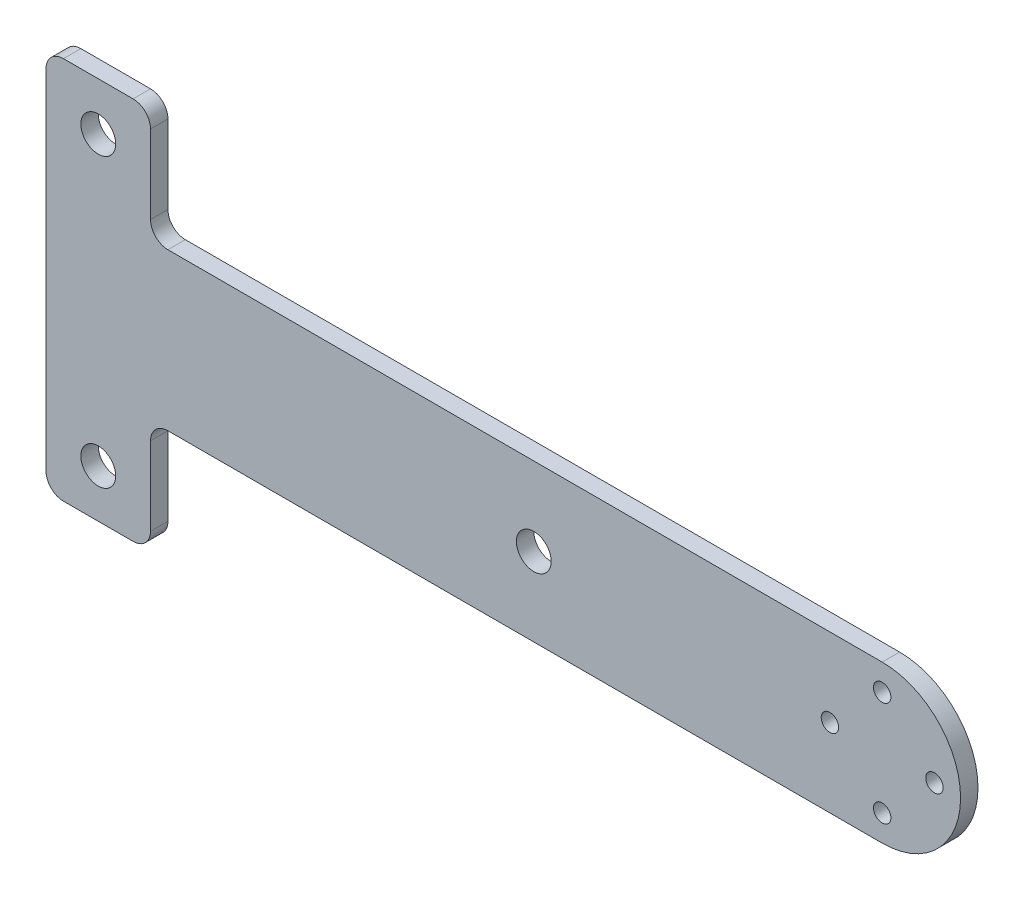
ISO-10303-21;
HEADER;
FILE_DESCRIPTION(('STEP AP214'),'2;1');
FILE_NAME('part.step','',(''),(''),'','','');
FILE_SCHEMA(('AUTOMOTIVE_DESIGN { 1 0 10303 214 1 1 1 1 }'));
ENDSEC;
DATA;
#1=APPLICATION_CONTEXT('core data for automotive mechanical design processes');
#2=APPLICATION_PROTOCOL_DEFINITION('international standard','automotive_design',2000,#1);
#3=PRODUCT_CONTEXT('',#1,'mechanical');
#4=PRODUCT('Part','Part','',(#3));
#5=PRODUCT_RELATED_PRODUCT_CATEGORY('part','',(#4));
#6=PRODUCT_DEFINITION_FORMATION('','',#4);
#7=PRODUCT_DEFINITION_CONTEXT('part definition',#1,'design');
#8=PRODUCT_DEFINITION('design','',#6,#7);
#9=PRODUCT_DEFINITION_SHAPE('','',#8);
#10=(LENGTH_UNIT() NAMED_UNIT(*) SI_UNIT(.MILLI.,.METRE.));
#11=(NAMED_UNIT(*) PLANE_ANGLE_UNIT() SI_UNIT($,.RADIAN.));
#12=(NAMED_UNIT(*) SI_UNIT($,.STERADIAN.) SOLID_ANGLE_UNIT());
#13=UNCERTAINTY_MEASURE_WITH_UNIT(LENGTH_MEASURE(1.E-05),#10,'distance_accuracy_value','');
#14=(GEOMETRIC_REPRESENTATION_CONTEXT(3) GLOBAL_UNCERTAINTY_ASSIGNED_CONTEXT((#13)) GLOBAL_UNIT_ASSIGNED_CONTEXT((#10,
#11,#12)) REPRESENTATION_CONTEXT('',''));
#15=CARTESIAN_POINT('',(0.,0.,0.));
#16=DIRECTION('',(0.,0.,1.));
#17=DIRECTION('',(1.,0.,0.));
#18=AXIS2_PLACEMENT_3D('',#15,#16,#17);
#19=CARTESIAN_POINT('',(41.2764285714286,0.145714285714315,2.));
#20=DIRECTION('',(0.,0.,-1.));
#21=DIRECTION('',(-1.,0.,0.));
#22=AXIS2_PLACEMENT_3D('',#19,#20,#21);
#23=CYLINDRICAL_SURFACE('',#22,9.);
#24=CARTESIAN_POINT('',(41.2764285714286,0.145714285714315,0.));
#25=DIRECTION('',(0.,0.,1.));
#26=DIRECTION('',(1.,0.,0.));
#27=AXIS2_PLACEMENT_3D('',#24,#25,#26);
#28=CIRCLE('',#27,9.);
#29=CARTESIAN_POINT('',(41.2764285714286,9.14571428571432,0.));
#30=VERTEX_POINT('',#29);
#31=CARTESIAN_POINT('',(41.2764285714286,-8.85428571428569,0.));
#32=VERTEX_POINT('',#31);
#33=EDGE_CURVE('E148',#30,#32,#28,.F.);
#34=ORIENTED_EDGE('',*,*,#33,.F.);
#35=DIRECTION('',(0.,0.,-1.));
#36=VECTOR('',#35,1.);
#37=CARTESIAN_POINT('',(41.2764285714286,9.14571428571432,2.));
#38=LINE('',#37,#36);
#39=CARTESIAN_POINT('',(41.2764285714286,9.14571428571432,2.));
#40=VERTEX_POINT('',#39);
#41=EDGE_CURVE('E143',#40,#30,#38,.T.);
#42=ORIENTED_EDGE('',*,*,#41,.F.);
#43=CARTESIAN_POINT('',(41.2764285714286,0.145714285714315,2.));
#44=DIRECTION('',(0.,0.,1.));
#45=DIRECTION('',(1.,0.,0.));
#46=AXIS2_PLACEMENT_3D('',#43,#44,#45);
#47=CIRCLE('',#46,9.);
#48=CARTESIAN_POINT('',(41.2764285714286,-8.85428571428569,2.));
#49=VERTEX_POINT('',#48);
#50=EDGE_CURVE('E146',#40,#49,#47,.F.);
#51=ORIENTED_EDGE('',*,*,#50,.T.);
#52=DIRECTION('',(0.,0.,-1.));
#53=VECTOR('',#52,1.);
#54=CARTESIAN_POINT('',(41.2764285714286,-8.85428571428569,2.));
#55=LINE('',#54,#53);
#56=EDGE_CURVE('E153',#49,#32,#55,.T.);
#57=ORIENTED_EDGE('',*,*,#56,.T.);
#58=EDGE_LOOP('',(#34,#42,#51,#57));
#59=FACE_BOUND('',#58,.T.);
#60=ADVANCED_FACE('F41',(#59),#23,.T.);
#61=CARTESIAN_POINT('',(0.,9.14571428571431,2.));
#62=DIRECTION('',(0.,-1.,0.));
#63=DIRECTION('',(1.,0.,0.));
#64=AXIS2_PLACEMENT_3D('',#61,#62,#63);
#65=PLANE('',#64);
#66=DIRECTION('',(-1.,0.,0.));
#67=VECTOR('',#66,1.);
#68=CARTESIAN_POINT('',(0.,9.14571428571431,0.));
#69=LINE('',#68,#67);
#70=CARTESIAN_POINT('',(-40.7235714285714,9.14571428571431,0.));
#71=VERTEX_POINT('',#70);
#72=EDGE_CURVE('E208',#30,#71,#69,.T.);
#73=ORIENTED_EDGE('',*,*,#72,.T.);
#74=DIRECTION('',(0.,0.,-1.));
#75=VECTOR('',#74,1.);
#76=CARTESIAN_POINT('',(-40.7235714285714,9.14571428571431,2.));
#77=LINE('',#76,#75);
#78=CARTESIAN_POINT('',(-40.7235714285714,9.14571428571431,2.));
#79=VERTEX_POINT('',#78);
#80=EDGE_CURVE('E159',#71,#79,#77,.F.);
#81=ORIENTED_EDGE('',*,*,#80,.T.);
#82=DIRECTION('',(-1.,0.,0.));
#83=VECTOR('',#82,1.);
#84=CARTESIAN_POINT('',(0.,9.14571428571431,2.));
#85=LINE('',#84,#83);
#86=EDGE_CURVE('E156',#40,#79,#85,.T.);
#87=ORIENTED_EDGE('',*,*,#86,.F.);
#88=ORIENTED_EDGE('',*,*,#41,.T.);
#89=EDGE_LOOP('',(#73,#81,#87,#88));
#90=FACE_BOUND('',#89,.T.);
#91=ADVANCED_FACE('F157',(#90),#65,.F.);
#92=CARTESIAN_POINT('',(-42.7235714285714,0.,2.));
#93=DIRECTION('',(-1.,0.,0.));
#94=DIRECTION('',(0.,0.,1.));
#95=AXIS2_PLACEMENT_3D('',#92,#93,#94);
#96=PLANE('',#95);
#97=DIRECTION('',(0.,1.,0.));
#98=VECTOR('',#97,1.);
#99=CARTESIAN_POINT('',(-42.7235714285714,0.,2.));
#100=LINE('',#99,#98);
#101=CARTESIAN_POINT('',(-42.7235714285714,11.1457142857143,2.));
#102=VERTEX_POINT('',#101);
#103=CARTESIAN_POINT('',(-42.7235714285714,20.1457142857143,2.));
#104=VERTEX_POINT('',#103);
#105=EDGE_CURVE('E161',#102,#104,#100,.T.);
#106=ORIENTED_EDGE('',*,*,#105,.F.);
#107=DIRECTION('',(0.,0.,-1.));
#108=VECTOR('',#107,1.);
#109=CARTESIAN_POINT('',(-42.7235714285714,11.1457142857143,0.));
#110=LINE('',#109,#108);
#111=CARTESIAN_POINT('',(-42.7235714285714,11.1457142857143,0.));
#112=VERTEX_POINT('',#111);
#113=EDGE_CURVE('E246',#102,#112,#110,.T.);
#114=ORIENTED_EDGE('',*,*,#113,.T.);
#115=DIRECTION('',(0.,1.,0.));
#116=VECTOR('',#115,1.);
#117=CARTESIAN_POINT('',(-42.7235714285714,0.,0.));
#118=LINE('',#117,#116);
#119=CARTESIAN_POINT('',(-42.7235714285714,20.1457142857143,0.));
#120=VERTEX_POINT('',#119);
#121=EDGE_CURVE('E210',#112,#120,#118,.T.);
#122=ORIENTED_EDGE('',*,*,#121,.T.);
#123=DIRECTION('',(0.,0.,-1.));
#124=VECTOR('',#123,1.);
#125=CARTESIAN_POINT('',(-42.7235714285714,20.1457142857143,2.));
#126=LINE('',#125,#124);
#127=EDGE_CURVE('E152',#120,#104,#126,.F.);
#128=ORIENTED_EDGE('',*,*,#127,.T.);
#129=EDGE_LOOP('',(#106,#114,#122,#128));
#130=FACE_BOUND('',#129,.T.);
#131=ADVANCED_FACE('F311',(#130),#96,.F.);
#132=CARTESIAN_POINT('',(0.,22.1457142857143,2.));
#133=DIRECTION('',(0.,-1.,0.));
#134=DIRECTION('',(0.,0.,-1.));
#135=AXIS2_PLACEMENT_3D('',#132,#133,#134);
#136=PLANE('',#135);
#137=DIRECTION('',(-1.,0.,0.));
#138=VECTOR('',#137,1.);
#139=CARTESIAN_POINT('',(0.,22.1457142857143,2.));
#140=LINE('',#139,#138);
#141=CARTESIAN_POINT('',(-44.7235714285714,22.1457142857143,2.));
#142=VERTEX_POINT('',#141);
#143=CARTESIAN_POINT('',(-52.7235714285714,22.1457142857143,2.));
#144=VERTEX_POINT('',#143);
#145=EDGE_CURVE('E174',#142,#144,#140,.T.);
#146=ORIENTED_EDGE('',*,*,#145,.F.);
#147=DIRECTION('',(0.,0.,-1.));
#148=VECTOR('',#147,1.);
#149=CARTESIAN_POINT('',(-44.7235714285714,22.1457142857143,2.));
#150=LINE('',#149,#148);
#151=CARTESIAN_POINT('',(-44.7235714285714,22.1457142857143,0.));
#152=VERTEX_POINT('',#151);
#153=EDGE_CURVE('E252',#142,#152,#150,.T.);
#154=ORIENTED_EDGE('',*,*,#153,.T.);
#155=DIRECTION('',(-1.,0.,0.));
#156=VECTOR('',#155,1.);
#157=CARTESIAN_POINT('',(0.,22.1457142857143,0.));
#158=LINE('',#157,#156);
#159=CARTESIAN_POINT('',(-52.7235714285714,22.1457142857143,0.));
#160=VERTEX_POINT('',#159);
#161=EDGE_CURVE('E213',#152,#160,#158,.T.);
#162=ORIENTED_EDGE('',*,*,#161,.T.);
#163=DIRECTION('',(0.,0.,-1.));
#164=VECTOR('',#163,1.);
#165=CARTESIAN_POINT('',(-52.7235714285714,22.1457142857143,2.));
#166=LINE('',#165,#164);
#167=EDGE_CURVE('E250',#160,#144,#166,.F.);
#168=ORIENTED_EDGE('',*,*,#167,.T.);
#169=EDGE_LOOP('',(#146,#154,#162,#168));
#170=FACE_BOUND('',#169,.T.);
#171=ADVANCED_FACE('F319',(#170),#136,.F.);
#172=CARTESIAN_POINT('',(-54.7235714285714,0.,2.));
#173=DIRECTION('',(1.,0.,0.));
#174=DIRECTION('',(0.,0.,-1.));
#175=AXIS2_PLACEMENT_3D('',#172,#173,#174);
#176=PLANE('',#175);
#177=DIRECTION('',(0.,-1.,0.));
#178=VECTOR('',#177,1.);
#179=CARTESIAN_POINT('',(-54.7235714285714,0.,2.));
#180=LINE('',#179,#178);
#181=CARTESIAN_POINT('',(-54.7235714285714,20.1457142857143,2.));
#182=VERTEX_POINT('',#181);
#183=CARTESIAN_POINT('',(-54.7235714285714,-19.8542857142857,2.));
#184=VERTEX_POINT('',#183);
#185=EDGE_CURVE('E177',#182,#184,#180,.T.);
#186=ORIENTED_EDGE('',*,*,#185,.F.);
#187=DIRECTION('',(0.,0.,-1.));
#188=VECTOR('',#187,1.);
#189=CARTESIAN_POINT('',(-54.7235714285714,20.1457142857143,2.));
#190=LINE('',#189,#188);
#191=CARTESIAN_POINT('',(-54.7235714285714,20.1457142857143,0.));
#192=VERTEX_POINT('',#191);
#193=EDGE_CURVE('E273',#182,#192,#190,.T.);
#194=ORIENTED_EDGE('',*,*,#193,.T.);
#195=DIRECTION('',(0.,-1.,0.));
#196=VECTOR('',#195,1.);
#197=CARTESIAN_POINT('',(-54.7235714285714,0.,0.));
#198=LINE('',#197,#196);
#199=CARTESIAN_POINT('',(-54.7235714285714,-19.8542857142857,0.));
#200=VERTEX_POINT('',#199);
#201=EDGE_CURVE('E216',#192,#200,#198,.T.);
#202=ORIENTED_EDGE('',*,*,#201,.T.);
#203=DIRECTION('',(0.,0.,-1.));
#204=VECTOR('',#203,1.);
#205=CARTESIAN_POINT('',(-54.7235714285714,-19.8542857142857,2.));
#206=LINE('',#205,#204);
#207=EDGE_CURVE('E271',#200,#184,#206,.F.);
#208=ORIENTED_EDGE('',*,*,#207,.T.);
#209=EDGE_LOOP('',(#186,#194,#202,#208));
#210=FACE_BOUND('',#209,.T.);
#211=ADVANCED_FACE('F327',(#210),#176,.F.);
#212=CARTESIAN_POINT('',(0.,-21.8542857142857,2.));
#213=DIRECTION('',(0.,1.,0.));
#214=DIRECTION('',(0.,0.,1.));
#215=AXIS2_PLACEMENT_3D('',#212,#213,#214);
#216=PLANE('',#215);
#217=DIRECTION('',(1.,0.,0.));
#218=VECTOR('',#217,1.);
#219=CARTESIAN_POINT('',(0.,-21.8542857142857,0.));
#220=LINE('',#219,#218);
#221=CARTESIAN_POINT('',(-52.7235714285714,-21.8542857142857,0.));
#222=VERTEX_POINT('',#221);
#223=CARTESIAN_POINT('',(-44.7235714285714,-21.8542857142857,0.));
#224=VERTEX_POINT('',#223);
#225=EDGE_CURVE('E219',#222,#224,#220,.T.);
#226=ORIENTED_EDGE('',*,*,#225,.T.);
#227=DIRECTION('',(0.,0.,-1.));
#228=VECTOR('',#227,1.);
#229=CARTESIAN_POINT('',(-44.7235714285714,-21.8542857142857,2.));
#230=LINE('',#229,#228);
#231=CARTESIAN_POINT('',(-44.7235714285714,-21.8542857142857,2.));
#232=VERTEX_POINT('',#231);
#233=EDGE_CURVE('E286',#224,#232,#230,.F.);
#234=ORIENTED_EDGE('',*,*,#233,.T.);
#235=DIRECTION('',(1.,0.,0.));
#236=VECTOR('',#235,1.);
#237=CARTESIAN_POINT('',(0.,-21.8542857142857,2.));
#238=LINE('',#237,#236);
#239=CARTESIAN_POINT('',(-52.7235714285714,-21.8542857142857,2.));
#240=VERTEX_POINT('',#239);
#241=EDGE_CURVE('E180',#240,#232,#238,.T.);
#242=ORIENTED_EDGE('',*,*,#241,.F.);
#243=DIRECTION('',(0.,0.,-1.));
#244=VECTOR('',#243,1.);
#245=CARTESIAN_POINT('',(-52.7235714285714,-21.8542857142857,2.));
#246=LINE('',#245,#244);
#247=EDGE_CURVE('E283',#240,#222,#246,.T.);
#248=ORIENTED_EDGE('',*,*,#247,.T.);
#249=EDGE_LOOP('',(#226,#234,#242,#248));
#250=FACE_BOUND('',#249,.T.);
#251=ADVANCED_FACE('F335',(#250),#216,.F.);
#252=CARTESIAN_POINT('',(-42.7235714285714,0.,2.));
#253=DIRECTION('',(-1.,0.,0.));
#254=DIRECTION('',(0.,-1.,0.));
#255=AXIS2_PLACEMENT_3D('',#252,#253,#254);
#256=PLANE('',#255);
#257=DIRECTION('',(0.,1.,0.));
#258=VECTOR('',#257,1.);
#259=CARTESIAN_POINT('',(-42.7235714285714,0.,0.));
#260=LINE('',#259,#258);
#261=CARTESIAN_POINT('',(-42.7235714285714,-19.8542857142857,0.));
#262=VERTEX_POINT('',#261);
#263=CARTESIAN_POINT('',(-42.7235714285714,-10.8542857142857,0.));
#264=VERTEX_POINT('',#263);
#265=EDGE_CURVE('E222',#262,#264,#260,.T.);
#266=ORIENTED_EDGE('',*,*,#265,.T.);
#267=DIRECTION('',(0.,0.,-1.));
#268=VECTOR('',#267,1.);
#269=CARTESIAN_POINT('',(-42.7235714285714,-10.8542857142857,2.));
#270=LINE('',#269,#268);
#271=CARTESIAN_POINT('',(-42.7235714285714,-10.8542857142857,2.));
#272=VERTEX_POINT('',#271);
#273=EDGE_CURVE('E62',#264,#272,#270,.F.);
#274=ORIENTED_EDGE('',*,*,#273,.T.);
#275=DIRECTION('',(0.,1.,0.));
#276=VECTOR('',#275,1.);
#277=CARTESIAN_POINT('',(-42.7235714285714,0.,2.));
#278=LINE('',#277,#276);
#279=CARTESIAN_POINT('',(-42.7235714285714,-19.8542857142857,2.));
#280=VERTEX_POINT('',#279);
#281=EDGE_CURVE('E183',#280,#272,#278,.T.);
#282=ORIENTED_EDGE('',*,*,#281,.F.);
#283=DIRECTION('',(0.,0.,-1.));
#284=VECTOR('',#283,1.);
#285=CARTESIAN_POINT('',(-42.7235714285714,-19.8542857142857,2.));
#286=LINE('',#285,#284);
#287=EDGE_CURVE('E279',#280,#262,#286,.T.);
#288=ORIENTED_EDGE('',*,*,#287,.T.);
#289=EDGE_LOOP('',(#266,#274,#282,#288));
#290=FACE_BOUND('',#289,.T.);
#291=ADVANCED_FACE('F299',(#290),#256,.F.);
#292=CARTESIAN_POINT('',(-48.7235714285714,16.6457142857143,2.));
#293=DIRECTION('',(0.,0.,-1.));
#294=DIRECTION('',(-1.,0.,0.));
#295=AXIS2_PLACEMENT_3D('',#292,#293,#294);
#296=CYLINDRICAL_SURFACE('',#295,2.);
#297=CARTESIAN_POINT('',(-48.7235714285714,16.6457142857143,2.));
#298=DIRECTION('',(0.,0.,1.));
#299=DIRECTION('',(1.,0.,0.));
#300=AXIS2_PLACEMENT_3D('',#297,#298,#299);
#301=CIRCLE('',#300,2.);
#302=CARTESIAN_POINT('',(-46.7235714285714,16.6457142857143,2.));
#303=VERTEX_POINT('',#302);
#304=EDGE_CURVE('E198',#303,#303,#301,.T.);
#305=ORIENTED_EDGE('',*,*,#304,.T.);
#306=EDGE_LOOP('',(#305));
#307=FACE_BOUND('',#306,.T.);
#308=CARTESIAN_POINT('',(-48.7235714285714,16.6457142857143,0.));
#309=DIRECTION('',(0.,0.,1.));
#310=DIRECTION('',(1.,0.,0.));
#311=AXIS2_PLACEMENT_3D('',#308,#309,#310);
#312=CIRCLE('',#311,2.);
#313=CARTESIAN_POINT('',(-46.7235714285714,16.6457142857143,0.));
#314=VERTEX_POINT('',#313);
#315=EDGE_CURVE('E239',#314,#314,#312,.T.);
#316=ORIENTED_EDGE('',*,*,#315,.F.);
#317=EDGE_LOOP('',(#316));
#318=FACE_BOUND('',#317,.T.);
#319=ADVANCED_FACE('F468',(#307,#318),#296,.F.);
#320=CARTESIAN_POINT('',(1.27642857142862,0.145714285714315,2.));
#321=DIRECTION('',(0.,0.,-1.));
#322=DIRECTION('',(-1.,0.,0.));
#323=AXIS2_PLACEMENT_3D('',#320,#321,#322);
#324=CYLINDRICAL_SURFACE('',#323,2.);
#325=CARTESIAN_POINT('',(1.27642857142862,0.145714285714315,2.));
#326=DIRECTION('',(0.,0.,1.));
#327=DIRECTION('',(1.,0.,0.));
#328=AXIS2_PLACEMENT_3D('',#325,#326,#327);
#329=CIRCLE('',#328,2.);
#330=CARTESIAN_POINT('',(3.27642857142862,0.145714285714315,2.));
#331=VERTEX_POINT('',#330);
#332=EDGE_CURVE('E195',#331,#331,#329,.T.);
#333=ORIENTED_EDGE('',*,*,#332,.T.);
#334=EDGE_LOOP('',(#333));
#335=FACE_BOUND('',#334,.T.);
#336=CARTESIAN_POINT('',(1.27642857142862,0.145714285714315,0.));
#337=DIRECTION('',(0.,0.,1.));
#338=DIRECTION('',(1.,0.,0.));
#339=AXIS2_PLACEMENT_3D('',#336,#337,#338);
#340=CIRCLE('',#339,2.);
#341=CARTESIAN_POINT('',(3.27642857142862,0.145714285714315,0.));
#342=VERTEX_POINT('',#341);
#343=EDGE_CURVE('E236',#342,#342,#340,.T.);
#344=ORIENTED_EDGE('',*,*,#343,.F.);
#345=EDGE_LOOP('',(#344));
#346=FACE_BOUND('',#345,.T.);
#347=ADVANCED_FACE('F459',(#335,#346),#324,.F.);
#348=CARTESIAN_POINT('',(47.2764285714288,0.145714285714464,2.));
#349=DIRECTION('',(0.,0.,-1.));
#350=DIRECTION('',(-1.,0.,0.));
#351=AXIS2_PLACEMENT_3D('',#348,#349,#350);
#352=CYLINDRICAL_SURFACE('',#351,0.999999999999998);
#353=CARTESIAN_POINT('',(47.2764285714288,0.145714285714464,2.));
#354=DIRECTION('',(0.,0.,1.));
#355=DIRECTION('',(1.,0.,0.));
#356=AXIS2_PLACEMENT_3D('',#353,#354,#355);
#357=CIRCLE('',#356,0.999999999999998);
#358=CARTESIAN_POINT('',(48.2764285714288,0.145714285714464,2.));
#359=VERTEX_POINT('',#358);
#360=EDGE_CURVE('E192',#359,#359,#357,.T.);
#361=ORIENTED_EDGE('',*,*,#360,.T.);
#362=EDGE_LOOP('',(#361));
#363=FACE_BOUND('',#362,.T.);
#364=CARTESIAN_POINT('',(47.2764285714288,0.145714285714464,0.));
#365=DIRECTION('',(0.,0.,1.));
#366=DIRECTION('',(1.,0.,0.));
#367=AXIS2_PLACEMENT_3D('',#364,#365,#366);
#368=CIRCLE('',#367,0.999999999999998);
#369=CARTESIAN_POINT('',(48.2764285714288,0.145714285714464,0.));
#370=VERTEX_POINT('',#369);
#371=EDGE_CURVE('E233',#370,#370,#368,.T.);
#372=ORIENTED_EDGE('',*,*,#371,.F.);
#373=EDGE_LOOP('',(#372));
#374=FACE_BOUND('',#373,.T.);
#375=ADVANCED_FACE('F450',(#363,#374),#352,.F.);
#376=CARTESIAN_POINT('',(41.2764285714289,-5.85428571428569,2.));
#377=DIRECTION('',(0.,0.,-1.));
#378=DIRECTION('',(-1.,0.,0.));
#379=AXIS2_PLACEMENT_3D('',#376,#377,#378);
#380=CYLINDRICAL_SURFACE('',#379,0.999999999999998);
#381=CARTESIAN_POINT('',(41.2764285714289,-5.85428571428569,2.));
#382=DIRECTION('',(0.,0.,1.));
#383=DIRECTION('',(1.,0.,0.));
#384=AXIS2_PLACEMENT_3D('',#381,#382,#383);
#385=CIRCLE('',#384,0.999999999999998);
#386=CARTESIAN_POINT('',(42.2764285714289,-5.85428571428569,2.));
#387=VERTEX_POINT('',#386);
#388=EDGE_CURVE('E189',#387,#387,#385,.T.);
#389=ORIENTED_EDGE('',*,*,#388,.T.);
#390=EDGE_LOOP('',(#389));
#391=FACE_BOUND('',#390,.T.);
#392=CARTESIAN_POINT('',(41.2764285714289,-5.85428571428569,0.));
#393=DIRECTION('',(0.,0.,1.));
#394=DIRECTION('',(1.,0.,0.));
#395=AXIS2_PLACEMENT_3D('',#392,#393,#394);
#396=CIRCLE('',#395,0.999999999999998);
#397=CARTESIAN_POINT('',(42.2764285714289,-5.85428571428569,0.));
#398=VERTEX_POINT('',#397);
#399=EDGE_CURVE('E230',#398,#398,#396,.T.);
#400=ORIENTED_EDGE('',*,*,#399,.F.);
#401=EDGE_LOOP('',(#400));
#402=FACE_BOUND('',#401,.T.);
#403=ADVANCED_FACE('F441',(#391,#402),#380,.F.);
#404=CARTESIAN_POINT('',(35.2764285714288,0.145714285714214,2.));
#405=DIRECTION('',(0.,0.,-1.));
#406=DIRECTION('',(-1.,0.,0.));
#407=AXIS2_PLACEMENT_3D('',#404,#405,#406);
#408=CYLINDRICAL_SURFACE('',#407,0.999999999999998);
#409=CARTESIAN_POINT('',(35.2764285714288,0.145714285714214,2.));
#410=DIRECTION('',(0.,0.,1.));
#411=DIRECTION('',(1.,0.,0.));
#412=AXIS2_PLACEMENT_3D('',#409,#410,#411);
#413=CIRCLE('',#412,0.999999999999998);
#414=CARTESIAN_POINT('',(36.2764285714288,0.145714285714214,2.));
#415=VERTEX_POINT('',#414);
#416=EDGE_CURVE('E186',#415,#415,#413,.T.);
#417=ORIENTED_EDGE('',*,*,#416,.T.);
#418=EDGE_LOOP('',(#417));
#419=FACE_BOUND('',#418,.T.);
#420=CARTESIAN_POINT('',(35.2764285714288,0.145714285714214,0.));
#421=DIRECTION('',(0.,0.,1.));
#422=DIRECTION('',(1.,0.,0.));
#423=AXIS2_PLACEMENT_3D('',#420,#421,#422);
#424=CIRCLE('',#423,0.999999999999998);
#425=CARTESIAN_POINT('',(36.2764285714288,0.145714285714214,0.));
#426=VERTEX_POINT('',#425);
#427=EDGE_CURVE('E227',#426,#426,#424,.T.);
#428=ORIENTED_EDGE('',*,*,#427,.F.);
#429=EDGE_LOOP('',(#428));
#430=FACE_BOUND('',#429,.T.);
#431=ADVANCED_FACE('F434',(#419,#430),#408,.F.);
#432=CARTESIAN_POINT('',(0.,-8.85428571428569,2.));
#433=DIRECTION('',(0.,-1.,0.));
#434=DIRECTION('',(1.,0.,0.));
#435=AXIS2_PLACEMENT_3D('',#432,#433,#434);
#436=PLANE('',#435);
#437=DIRECTION('',(-1.,0.,0.));
#438=VECTOR('',#437,1.);
#439=CARTESIAN_POINT('',(0.,-8.85428571428569,2.));
#440=LINE('',#439,#438);
#441=CARTESIAN_POINT('',(-40.7235714285714,-8.8542857142857,2.));
#442=VERTEX_POINT('',#441);
#443=EDGE_CURVE('E166',#49,#442,#440,.T.);
#444=ORIENTED_EDGE('',*,*,#443,.T.);
#445=DIRECTION('',(0.,0.,-1.));
#446=VECTOR('',#445,1.);
#447=CARTESIAN_POINT('',(-40.7235714285714,-8.8542857142857,2.));
#448=LINE('',#447,#446);
#449=CARTESIAN_POINT('',(-40.7235714285714,-8.8542857142857,0.));
#450=VERTEX_POINT('',#449);
#451=EDGE_CURVE('E276',#442,#450,#448,.T.);
#452=ORIENTED_EDGE('',*,*,#451,.T.);
#453=DIRECTION('',(-1.,0.,0.));
#454=VECTOR('',#453,1.);
#455=CARTESIAN_POINT('',(0.,-8.85428571428569,0.));
#456=LINE('',#455,#454);
#457=EDGE_CURVE('E224',#32,#450,#456,.T.);
#458=ORIENTED_EDGE('',*,*,#457,.F.);
#459=ORIENTED_EDGE('',*,*,#56,.F.);
#460=EDGE_LOOP('',(#444,#452,#458,#459));
#461=FACE_BOUND('',#460,.T.);
#462=ADVANCED_FACE('F303',(#461),#436,.T.);
#463=CARTESIAN_POINT('',(41.2764285714286,6.14571428571432,2.));
#464=DIRECTION('',(0.,0.,-1.));
#465=DIRECTION('',(-1.,0.,0.));
#466=AXIS2_PLACEMENT_3D('',#463,#464,#465);
#467=CYLINDRICAL_SURFACE('',#466,0.999999999999998);
#468=CARTESIAN_POINT('',(41.2764285714286,6.14571428571432,2.));
#469=DIRECTION('',(0.,0.,1.));
#470=DIRECTION('',(1.,0.,0.));
#471=AXIS2_PLACEMENT_3D('',#468,#469,#470);
#472=CIRCLE('',#471,0.999999999999998);
#473=CARTESIAN_POINT('',(42.2764285714286,6.14571428571432,2.));
#474=VERTEX_POINT('',#473);
#475=EDGE_CURVE('E167',#474,#474,#472,.T.);
#476=ORIENTED_EDGE('',*,*,#475,.T.);
#477=EDGE_LOOP('',(#476));
#478=FACE_BOUND('',#477,.T.);
#479=CARTESIAN_POINT('',(41.2764285714286,6.14571428571432,0.));
#480=DIRECTION('',(0.,0.,1.));
#481=DIRECTION('',(1.,0.,0.));
#482=AXIS2_PLACEMENT_3D('',#479,#480,#481);
#483=CIRCLE('',#482,0.999999999999998);
#484=CARTESIAN_POINT('',(42.2764285714286,6.14571428571432,0.));
#485=VERTEX_POINT('',#484);
#486=EDGE_CURVE('E204',#485,#485,#483,.T.);
#487=ORIENTED_EDGE('',*,*,#486,.F.);
#488=EDGE_LOOP('',(#487));
#489=FACE_BOUND('',#488,.T.);
#490=ADVANCED_FACE('F355',(#478,#489),#467,.F.);
#491=CARTESIAN_POINT('',(-48.7235714285714,-16.3542857142857,2.));
#492=DIRECTION('',(0.,0.,-1.));
#493=DIRECTION('',(-1.,0.,0.));
#494=AXIS2_PLACEMENT_3D('',#491,#492,#493);
#495=CYLINDRICAL_SURFACE('',#494,2.);
#496=CARTESIAN_POINT('',(-48.7235714285714,-16.3542857142857,2.));
#497=DIRECTION('',(0.,0.,1.));
#498=DIRECTION('',(1.,0.,0.));
#499=AXIS2_PLACEMENT_3D('',#496,#497,#498);
#500=CIRCLE('',#499,2.);
#501=CARTESIAN_POINT('',(-46.7235714285714,-16.3542857142857,2.));
#502=VERTEX_POINT('',#501);
#503=EDGE_CURVE('E201',#502,#502,#500,.F.);
#504=ORIENTED_EDGE('',*,*,#503,.F.);
#505=EDGE_LOOP('',(#504));
#506=FACE_BOUND('',#505,.T.);
#507=CARTESIAN_POINT('',(-48.7235714285714,-16.3542857142857,0.));
#508=DIRECTION('',(0.,0.,1.));
#509=DIRECTION('',(1.,0.,0.));
#510=AXIS2_PLACEMENT_3D('',#507,#508,#509);
#511=CIRCLE('',#510,2.);
#512=CARTESIAN_POINT('',(-46.7235714285714,-16.3542857142857,0.));
#513=VERTEX_POINT('',#512);
#514=EDGE_CURVE('E170',#513,#513,#511,.F.);
#515=ORIENTED_EDGE('',*,*,#514,.T.);
#516=EDGE_LOOP('',(#515));
#517=FACE_BOUND('',#516,.T.);
#518=ADVANCED_FACE('F358',(#506,#517),#495,.F.);
#519=CARTESIAN_POINT('',(0.,0.,2.));
#520=DIRECTION('',(0.,0.,1.));
#521=DIRECTION('',(1.,0.,0.));
#522=AXIS2_PLACEMENT_3D('',#519,#520,#521);
#523=PLANE('',#522);
#524=ORIENTED_EDGE('',*,*,#475,.F.);
#525=EDGE_LOOP('',(#524));
#526=FACE_BOUND('',#525,.T.);
#527=ORIENTED_EDGE('',*,*,#105,.T.);
#528=CARTESIAN_POINT('',(-44.7235714285714,20.1457142857143,2.));
#529=DIRECTION('',(0.,0.,1.));
#530=DIRECTION('',(1.,0.,0.));
#531=AXIS2_PLACEMENT_3D('',#528,#529,#530);
#532=CIRCLE('',#531,2.);
#533=EDGE_CURVE('E269',#104,#142,#532,.T.);
#534=ORIENTED_EDGE('',*,*,#533,.T.);
#535=ORIENTED_EDGE('',*,*,#145,.T.);
#536=CARTESIAN_POINT('',(-52.7235714285714,20.1457142857143,2.));
#537=DIRECTION('',(0.,0.,1.));
#538=DIRECTION('',(1.,0.,0.));
#539=AXIS2_PLACEMENT_3D('',#536,#537,#538);
#540=CIRCLE('',#539,2.);
#541=EDGE_CURVE('E267',#144,#182,#540,.T.);
#542=ORIENTED_EDGE('',*,*,#541,.T.);
#543=ORIENTED_EDGE('',*,*,#185,.T.);
#544=CARTESIAN_POINT('',(-52.7235714285714,-19.8542857142857,2.));
#545=DIRECTION('',(0.,0.,1.));
#546=DIRECTION('',(1.,0.,0.));
#547=AXIS2_PLACEMENT_3D('',#544,#545,#546);
#548=CIRCLE('',#547,2.);
#549=EDGE_CURVE('E263',#184,#240,#548,.T.);
#550=ORIENTED_EDGE('',*,*,#549,.T.);
#551=ORIENTED_EDGE('',*,*,#241,.T.);
#552=CARTESIAN_POINT('',(-44.7235714285714,-19.8542857142857,2.));
#553=DIRECTION('',(0.,0.,1.));
#554=DIRECTION('',(1.,0.,0.));
#555=AXIS2_PLACEMENT_3D('',#552,#553,#554);
#556=CIRCLE('',#555,2.);
#557=EDGE_CURVE('E265',#232,#280,#556,.T.);
#558=ORIENTED_EDGE('',*,*,#557,.T.);
#559=ORIENTED_EDGE('',*,*,#281,.T.);
#560=CARTESIAN_POINT('',(-40.7235714285714,-10.8542857142857,2.));
#561=DIRECTION('',(0.,0.,1.));
#562=DIRECTION('',(1.,0.,0.));
#563=AXIS2_PLACEMENT_3D('',#560,#561,#562);
#564=CIRCLE('',#563,2.);
#565=EDGE_CURVE('E11',#272,#442,#564,.F.);
#566=ORIENTED_EDGE('',*,*,#565,.T.);
#567=ORIENTED_EDGE('',*,*,#443,.F.);
#568=ORIENTED_EDGE('',*,*,#50,.F.);
#569=ORIENTED_EDGE('',*,*,#86,.T.);
#570=CARTESIAN_POINT('',(-40.7235714285714,11.1457142857143,2.));
#571=DIRECTION('',(0.,0.,1.));
#572=DIRECTION('',(1.,0.,0.));
#573=AXIS2_PLACEMENT_3D('',#570,#571,#572);
#574=CIRCLE('',#573,2.);
#575=EDGE_CURVE('E290',#79,#102,#574,.F.);
#576=ORIENTED_EDGE('',*,*,#575,.T.);
#577=EDGE_LOOP('',(#527,#534,#535,#542,#543,#550,#551,#558,#559,#566,#567,#568,#569,#576));
#578=FACE_BOUND('',#577,.T.);
#579=ORIENTED_EDGE('',*,*,#416,.F.);
#580=EDGE_LOOP('',(#579));
#581=FACE_BOUND('',#580,.T.);
#582=ORIENTED_EDGE('',*,*,#388,.F.);
#583=EDGE_LOOP('',(#582));
#584=FACE_BOUND('',#583,.T.);
#585=ORIENTED_EDGE('',*,*,#360,.F.);
#586=EDGE_LOOP('',(#585));
#587=FACE_BOUND('',#586,.T.);
#588=ORIENTED_EDGE('',*,*,#332,.F.);
#589=EDGE_LOOP('',(#588));
#590=FACE_BOUND('',#589,.T.);
#591=ORIENTED_EDGE('',*,*,#304,.F.);
#592=EDGE_LOOP('',(#591));
#593=FACE_BOUND('',#592,.T.);
#594=ORIENTED_EDGE('',*,*,#503,.T.);
#595=EDGE_LOOP('',(#594));
#596=FACE_BOUND('',#595,.T.);
#597=ADVANCED_FACE('F164',(#526,#578,#581,#584,#587,#590,#593,#596),#523,.T.);
#598=CARTESIAN_POINT('',(0.,0.,0.));
#599=DIRECTION('',(0.,0.,1.));
#600=DIRECTION('',(1.,0.,0.));
#601=AXIS2_PLACEMENT_3D('',#598,#599,#600);
#602=PLANE('',#601);
#603=ORIENTED_EDGE('',*,*,#486,.T.);
#604=EDGE_LOOP('',(#603));
#605=FACE_BOUND('',#604,.T.);
#606=ORIENTED_EDGE('',*,*,#161,.F.);
#607=CARTESIAN_POINT('',(-44.7235714285714,20.1457142857143,0.));
#608=DIRECTION('',(0.,0.,1.));
#609=DIRECTION('',(1.,0.,0.));
#610=AXIS2_PLACEMENT_3D('',#607,#608,#609);
#611=CIRCLE('',#610,2.);
#612=EDGE_CURVE('E261',#152,#120,#611,.F.);
#613=ORIENTED_EDGE('',*,*,#612,.T.);
#614=ORIENTED_EDGE('',*,*,#121,.F.);
#615=CARTESIAN_POINT('',(-40.7235714285714,11.1457142857143,0.));
#616=DIRECTION('',(0.,0.,1.));
#617=DIRECTION('',(1.,0.,0.));
#618=AXIS2_PLACEMENT_3D('',#615,#616,#617);
#619=CIRCLE('',#618,2.);
#620=EDGE_CURVE('E288',#112,#71,#619,.T.);
#621=ORIENTED_EDGE('',*,*,#620,.T.);
#622=ORIENTED_EDGE('',*,*,#72,.F.);
#623=ORIENTED_EDGE('',*,*,#33,.T.);
#624=ORIENTED_EDGE('',*,*,#457,.T.);
#625=CARTESIAN_POINT('',(-40.7235714285714,-10.8542857142857,0.));
#626=DIRECTION('',(0.,0.,1.));
#627=DIRECTION('',(1.,0.,0.));
#628=AXIS2_PLACEMENT_3D('',#625,#626,#627);
#629=CIRCLE('',#628,2.);
#630=EDGE_CURVE('E49',#450,#264,#629,.T.);
#631=ORIENTED_EDGE('',*,*,#630,.T.);
#632=ORIENTED_EDGE('',*,*,#265,.F.);
#633=CARTESIAN_POINT('',(-44.7235714285714,-19.8542857142857,0.));
#634=DIRECTION('',(0.,0.,1.));
#635=DIRECTION('',(1.,0.,0.));
#636=AXIS2_PLACEMENT_3D('',#633,#634,#635);
#637=CIRCLE('',#636,2.);
#638=EDGE_CURVE('E257',#262,#224,#637,.F.);
#639=ORIENTED_EDGE('',*,*,#638,.T.);
#640=ORIENTED_EDGE('',*,*,#225,.F.);
#641=CARTESIAN_POINT('',(-52.7235714285714,-19.8542857142857,0.));
#642=DIRECTION('',(0.,0.,1.));
#643=DIRECTION('',(1.,0.,0.));
#644=AXIS2_PLACEMENT_3D('',#641,#642,#643);
#645=CIRCLE('',#644,2.);
#646=EDGE_CURVE('E255',#222,#200,#645,.F.);
#647=ORIENTED_EDGE('',*,*,#646,.T.);
#648=ORIENTED_EDGE('',*,*,#201,.F.);
#649=CARTESIAN_POINT('',(-52.7235714285714,20.1457142857143,0.));
#650=DIRECTION('',(0.,0.,1.));
#651=DIRECTION('',(1.,0.,0.));
#652=AXIS2_PLACEMENT_3D('',#649,#650,#651);
#653=CIRCLE('',#652,2.);
#654=EDGE_CURVE('E259',#192,#160,#653,.F.);
#655=ORIENTED_EDGE('',*,*,#654,.T.);
#656=EDGE_LOOP('',(#606,#613,#614,#621,#622,#623,#624,#631,#632,#639,#640,#647,#648,#655));
#657=FACE_BOUND('',#656,.T.);
#658=ORIENTED_EDGE('',*,*,#427,.T.);
#659=EDGE_LOOP('',(#658));
#660=FACE_BOUND('',#659,.T.);
#661=ORIENTED_EDGE('',*,*,#399,.T.);
#662=EDGE_LOOP('',(#661));
#663=FACE_BOUND('',#662,.T.);
#664=ORIENTED_EDGE('',*,*,#371,.T.);
#665=EDGE_LOOP('',(#664));
#666=FACE_BOUND('',#665,.T.);
#667=ORIENTED_EDGE('',*,*,#343,.T.);
#668=EDGE_LOOP('',(#667));
#669=FACE_BOUND('',#668,.T.);
#670=ORIENTED_EDGE('',*,*,#315,.T.);
#671=EDGE_LOOP('',(#670));
#672=FACE_BOUND('',#671,.T.);
#673=ORIENTED_EDGE('',*,*,#514,.F.);
#674=EDGE_LOOP('',(#673));
#675=FACE_BOUND('',#674,.T.);
#676=ADVANCED_FACE('F294',(#605,#657,#660,#663,#666,#669,#672,#675),#602,.F.);
#677=CARTESIAN_POINT('',(-40.7235714285714,11.1457142857143,2.));
#678=DIRECTION('',(0.,0.,1.));
#679=DIRECTION('',(1.,0.,0.));
#680=AXIS2_PLACEMENT_3D('',#677,#678,#679);
#681=CYLINDRICAL_SURFACE('',#680,2.);
#682=ORIENTED_EDGE('',*,*,#575,.F.);
#683=ORIENTED_EDGE('',*,*,#80,.F.);
#684=ORIENTED_EDGE('',*,*,#620,.F.);
#685=ORIENTED_EDGE('',*,*,#113,.F.);
#686=EDGE_LOOP('',(#682,#683,#684,#685));
#687=FACE_BOUND('',#686,.T.);
#688=ADVANCED_FACE('F306',(#687),#681,.F.);
#689=CARTESIAN_POINT('',(-44.7235714285714,20.1457142857143,2.));
#690=DIRECTION('',(0.,0.,-1.));
#691=DIRECTION('',(-1.,0.,0.));
#692=AXIS2_PLACEMENT_3D('',#689,#690,#691);
#693=CYLINDRICAL_SURFACE('',#692,2.);
#694=ORIENTED_EDGE('',*,*,#533,.F.);
#695=ORIENTED_EDGE('',*,*,#127,.F.);
#696=ORIENTED_EDGE('',*,*,#612,.F.);
#697=ORIENTED_EDGE('',*,*,#153,.F.);
#698=EDGE_LOOP('',(#694,#695,#696,#697));
#699=FACE_BOUND('',#698,.T.);
#700=ADVANCED_FACE('F314',(#699),#693,.T.);
#701=CARTESIAN_POINT('',(-52.7235714285714,20.1457142857143,2.));
#702=DIRECTION('',(0.,0.,-1.));
#703=DIRECTION('',(-1.,0.,0.));
#704=AXIS2_PLACEMENT_3D('',#701,#702,#703);
#705=CYLINDRICAL_SURFACE('',#704,2.);
#706=ORIENTED_EDGE('',*,*,#541,.F.);
#707=ORIENTED_EDGE('',*,*,#167,.F.);
#708=ORIENTED_EDGE('',*,*,#654,.F.);
#709=ORIENTED_EDGE('',*,*,#193,.F.);
#710=EDGE_LOOP('',(#706,#707,#708,#709));
#711=FACE_BOUND('',#710,.T.);
#712=ADVANCED_FACE('F322',(#711),#705,.T.);
#713=CARTESIAN_POINT('',(-40.7235714285714,-10.8542857142857,2.));
#714=DIRECTION('',(0.,0.,-1.));
#715=DIRECTION('',(-1.,0.,0.));
#716=AXIS2_PLACEMENT_3D('',#713,#714,#715);
#717=CYLINDRICAL_SURFACE('',#716,2.);
#718=ORIENTED_EDGE('',*,*,#565,.F.);
#719=ORIENTED_EDGE('',*,*,#273,.F.);
#720=ORIENTED_EDGE('',*,*,#630,.F.);
#721=ORIENTED_EDGE('',*,*,#451,.F.);
#722=EDGE_LOOP('',(#718,#719,#720,#721));
#723=FACE_BOUND('',#722,.T.);
#724=ADVANCED_FACE('F301',(#723),#717,.F.);
#725=CARTESIAN_POINT('',(-44.7235714285714,-19.8542857142857,2.));
#726=DIRECTION('',(0.,0.,-1.));
#727=DIRECTION('',(-1.,0.,0.));
#728=AXIS2_PLACEMENT_3D('',#725,#726,#727);
#729=CYLINDRICAL_SURFACE('',#728,2.);
#730=ORIENTED_EDGE('',*,*,#557,.F.);
#731=ORIENTED_EDGE('',*,*,#233,.F.);
#732=ORIENTED_EDGE('',*,*,#638,.F.);
#733=ORIENTED_EDGE('',*,*,#287,.F.);
#734=EDGE_LOOP('',(#730,#731,#732,#733));
#735=FACE_BOUND('',#734,.T.);
#736=ADVANCED_FACE('F339',(#735),#729,.T.);
#737=CARTESIAN_POINT('',(-52.7235714285714,-19.8542857142857,2.));
#738=DIRECTION('',(0.,0.,-1.));
#739=DIRECTION('',(-1.,0.,0.));
#740=AXIS2_PLACEMENT_3D('',#737,#738,#739);
#741=CYLINDRICAL_SURFACE('',#740,2.);
#742=ORIENTED_EDGE('',*,*,#549,.F.);
#743=ORIENTED_EDGE('',*,*,#207,.F.);
#744=ORIENTED_EDGE('',*,*,#646,.F.);
#745=ORIENTED_EDGE('',*,*,#247,.F.);
#746=EDGE_LOOP('',(#742,#743,#744,#745));
#747=FACE_BOUND('',#746,.T.);
#748=ADVANCED_FACE('F43',(#747),#741,.T.);
#749=CLOSED_SHELL('',(#60,#91,#131,#171,#211,#251,#291,#319,#347,#375,#403,#431,#462,#490,#518,
#597,#676,#688,#700,#712,#724,#736,#748));
#750=MANIFOLD_SOLID_BREP('B2',#749);
#751=ADVANCED_BREP_SHAPE_REPRESENTATION('',(#18,#750),#14);
#752=SHAPE_DEFINITION_REPRESENTATION(#9,#751);
ENDSEC;
END-ISO-10303-21;
